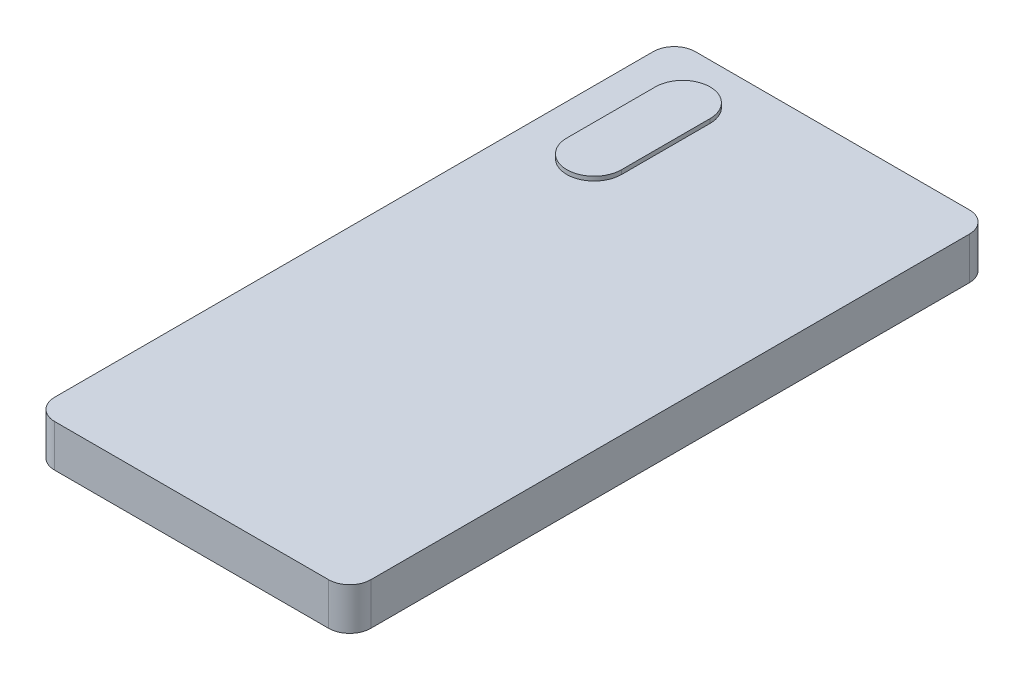
ISO-10303-21;
HEADER;
FILE_DESCRIPTION(('STEP AP214'),'2;1');
FILE_NAME('part.step','',(''),(''),'','','');
FILE_SCHEMA(('AUTOMOTIVE_DESIGN { 1 0 10303 214 1 1 1 1 }'));
ENDSEC;
DATA;
#1=APPLICATION_CONTEXT('core data for automotive mechanical design processes');
#2=APPLICATION_PROTOCOL_DEFINITION('international standard','automotive_design',2000,#1);
#3=PRODUCT_CONTEXT('',#1,'mechanical');
#4=PRODUCT('Part','Part','',(#3));
#5=PRODUCT_RELATED_PRODUCT_CATEGORY('part','',(#4));
#6=PRODUCT_DEFINITION_FORMATION('','',#4);
#7=PRODUCT_DEFINITION_CONTEXT('part definition',#1,'design');
#8=PRODUCT_DEFINITION('design','',#6,#7);
#9=PRODUCT_DEFINITION_SHAPE('','',#8);
#10=(LENGTH_UNIT() NAMED_UNIT(*) SI_UNIT(.MILLI.,.METRE.));
#11=(NAMED_UNIT(*) PLANE_ANGLE_UNIT() SI_UNIT($,.RADIAN.));
#12=(NAMED_UNIT(*) SI_UNIT($,.STERADIAN.) SOLID_ANGLE_UNIT());
#13=UNCERTAINTY_MEASURE_WITH_UNIT(LENGTH_MEASURE(1.E-05),#10,'distance_accuracy_value','');
#14=(GEOMETRIC_REPRESENTATION_CONTEXT(3) GLOBAL_UNCERTAINTY_ASSIGNED_CONTEXT((#13)) GLOBAL_UNIT_ASSIGNED_CONTEXT((#10,
#11,#12)) REPRESENTATION_CONTEXT('',''));
#15=CARTESIAN_POINT('',(0.,0.,0.));
#16=DIRECTION('',(0.,0.,1.));
#17=DIRECTION('',(1.,0.,0.));
#18=AXIS2_PLACEMENT_3D('',#15,#16,#17);
#19=CARTESIAN_POINT('',(-32.5,10.,71.));
#20=DIRECTION('',(0.,1.,0.));
#21=DIRECTION('',(0.,0.,1.));
#22=AXIS2_PLACEMENT_3D('',#19,#20,#21);
#23=PLANE('',#22);
#24=CARTESIAN_POINT('',(-32.5,10.,71.));
#25=DIRECTION('',(0.,1.,0.));
#26=DIRECTION('',(0.,0.,1.));
#27=AXIS2_PLACEMENT_3D('',#24,#25,#26);
#28=CIRCLE('',#27,5.);
#29=CARTESIAN_POINT('',(-37.5,10.,71.));
#30=VERTEX_POINT('',#29);
#31=CARTESIAN_POINT('',(-32.5,10.,76.));
#32=VERTEX_POINT('',#31);
#33=EDGE_CURVE('E166',#30,#32,#28,.T.);
#34=ORIENTED_EDGE('',*,*,#33,.T.);
#35=DIRECTION('',(1.,0.,0.));
#36=VECTOR('',#35,1.);
#37=CARTESIAN_POINT('',(-32.5,10.,76.));
#38=LINE('',#37,#36);
#39=CARTESIAN_POINT('',(32.5,10.,76.));
#40=VERTEX_POINT('',#39);
#41=EDGE_CURVE('E106',#32,#40,#38,.T.);
#42=ORIENTED_EDGE('',*,*,#41,.T.);
#43=CARTESIAN_POINT('',(32.5,10.,71.));
#44=DIRECTION('',(0.,1.,0.));
#45=DIRECTION('',(0.,0.,-1.));
#46=AXIS2_PLACEMENT_3D('',#43,#44,#45);
#47=CIRCLE('',#46,5.);
#48=CARTESIAN_POINT('',(37.5,10.,71.));
#49=VERTEX_POINT('',#48);
#50=EDGE_CURVE('E181',#40,#49,#47,.T.);
#51=ORIENTED_EDGE('',*,*,#50,.T.);
#52=DIRECTION('',(0.,0.,-1.));
#53=VECTOR('',#52,1.);
#54=CARTESIAN_POINT('',(37.5,10.,-71.));
#55=LINE('',#54,#53);
#56=CARTESIAN_POINT('',(37.5,10.,-71.));
#57=VERTEX_POINT('',#56);
#58=EDGE_CURVE('E193',#49,#57,#55,.T.);
#59=ORIENTED_EDGE('',*,*,#58,.T.);
#60=CARTESIAN_POINT('',(32.5,10.,-71.));
#61=DIRECTION('',(0.,1.,0.));
#62=DIRECTION('',(0.,0.,1.));
#63=AXIS2_PLACEMENT_3D('',#60,#61,#62);
#64=CIRCLE('',#63,5.);
#65=CARTESIAN_POINT('',(32.4999999999999,10.,-76.));
#66=VERTEX_POINT('',#65);
#67=EDGE_CURVE('E129',#57,#66,#64,.T.);
#68=ORIENTED_EDGE('',*,*,#67,.T.);
#69=DIRECTION('',(-1.,0.,0.));
#70=VECTOR('',#69,1.);
#71=CARTESIAN_POINT('',(-32.5,10.,-76.));
#72=LINE('',#71,#70);
#73=CARTESIAN_POINT('',(-32.5,10.,-76.));
#74=VERTEX_POINT('',#73);
#75=EDGE_CURVE('E122',#66,#74,#72,.T.);
#76=ORIENTED_EDGE('',*,*,#75,.T.);
#77=CARTESIAN_POINT('',(-32.5,10.,-71.));
#78=DIRECTION('',(0.,1.,0.));
#79=DIRECTION('',(0.,0.,-1.));
#80=AXIS2_PLACEMENT_3D('',#77,#78,#79);
#81=CIRCLE('',#80,5.);
#82=CARTESIAN_POINT('',(-37.5,10.,-71.));
#83=VERTEX_POINT('',#82);
#84=EDGE_CURVE('E126',#74,#83,#81,.T.);
#85=ORIENTED_EDGE('',*,*,#84,.T.);
#86=DIRECTION('',(0.,0.,1.));
#87=VECTOR('',#86,1.);
#88=CARTESIAN_POINT('',(-37.5,10.,-71.));
#89=LINE('',#88,#87);
#90=EDGE_CURVE('E65',#83,#30,#89,.T.);
#91=ORIENTED_EDGE('',*,*,#90,.T.);
#92=EDGE_LOOP('',(#34,#42,#51,#59,#68,#76,#85,#91));
#93=FACE_BOUND('',#92,.T.);
#94=DIRECTION('',(0.,0.,1.));
#95=VECTOR('',#94,1.);
#96=CARTESIAN_POINT('',(-29.,10.,-63.));
#97=LINE('',#96,#95);
#98=CARTESIAN_POINT('',(-29.,10.,-63.));
#99=VERTEX_POINT('',#98);
#100=CARTESIAN_POINT('',(-29.,10.,-42.));
#101=VERTEX_POINT('',#100);
#102=EDGE_CURVE('E214',#99,#101,#97,.T.);
#103=ORIENTED_EDGE('',*,*,#102,.F.);
#104=CARTESIAN_POINT('',(-22.5,10.,-63.));
#105=DIRECTION('',(0.,1.,0.));
#106=DIRECTION('',(0.,0.,-1.));
#107=AXIS2_PLACEMENT_3D('',#104,#105,#106);
#108=CIRCLE('',#107,6.5);
#109=CARTESIAN_POINT('',(-16.,10.,-63.));
#110=VERTEX_POINT('',#109);
#111=EDGE_CURVE('E217',#110,#99,#108,.T.);
#112=ORIENTED_EDGE('',*,*,#111,.F.);
#113=DIRECTION('',(0.,0.,-1.));
#114=VECTOR('',#113,1.);
#115=CARTESIAN_POINT('',(-16.,10.,-63.));
#116=LINE('',#115,#114);
#117=CARTESIAN_POINT('',(-16.,10.,-42.));
#118=VERTEX_POINT('',#117);
#119=EDGE_CURVE('E209',#118,#110,#116,.T.);
#120=ORIENTED_EDGE('',*,*,#119,.F.);
#121=CARTESIAN_POINT('',(-22.5,10.,-42.));
#122=DIRECTION('',(0.,1.,0.));
#123=DIRECTION('',(0.,0.,1.));
#124=AXIS2_PLACEMENT_3D('',#121,#122,#123);
#125=CIRCLE('',#124,6.5);
#126=EDGE_CURVE('E212',#101,#118,#125,.T.);
#127=ORIENTED_EDGE('',*,*,#126,.F.);
#128=EDGE_LOOP('',(#103,#112,#120,#127));
#129=FACE_BOUND('',#128,.T.);
#130=ADVANCED_FACE('F41',(#93,#129),#23,.T.);
#131=CARTESIAN_POINT('',(-32.5,10.,71.));
#132=DIRECTION('',(0.,-1.,0.));
#133=DIRECTION('',(0.,0.,-1.));
#134=AXIS2_PLACEMENT_3D('',#131,#132,#133);
#135=CYLINDRICAL_SURFACE('',#134,5.);
#136=CARTESIAN_POINT('',(-32.5,0.,71.));
#137=DIRECTION('',(0.,1.,0.));
#138=DIRECTION('',(0.,0.,1.));
#139=AXIS2_PLACEMENT_3D('',#136,#137,#138);
#140=CIRCLE('',#139,5.);
#141=CARTESIAN_POINT('',(-37.5,0.,71.));
#142=VERTEX_POINT('',#141);
#143=CARTESIAN_POINT('',(-32.5,0.,76.));
#144=VERTEX_POINT('',#143);
#145=EDGE_CURVE('E150',#142,#144,#140,.T.);
#146=ORIENTED_EDGE('',*,*,#145,.T.);
#147=DIRECTION('',(0.,-1.,0.));
#148=VECTOR('',#147,1.);
#149=CARTESIAN_POINT('',(-32.5,10.,76.));
#150=LINE('',#149,#148);
#151=EDGE_CURVE('E11',#32,#144,#150,.T.);
#152=ORIENTED_EDGE('',*,*,#151,.F.);
#153=ORIENTED_EDGE('',*,*,#33,.F.);
#154=DIRECTION('',(0.,-1.,0.));
#155=VECTOR('',#154,1.);
#156=CARTESIAN_POINT('',(-37.5,10.,71.));
#157=LINE('',#156,#155);
#158=EDGE_CURVE('E146',#30,#142,#157,.T.);
#159=ORIENTED_EDGE('',*,*,#158,.T.);
#160=EDGE_LOOP('',(#146,#152,#153,#159));
#161=FACE_BOUND('',#160,.T.);
#162=ADVANCED_FACE('F43',(#161),#135,.T.);
#163=CARTESIAN_POINT('',(-32.5,10.,76.));
#164=DIRECTION('',(0.,0.,-1.));
#165=DIRECTION('',(-1.,0.,0.));
#166=AXIS2_PLACEMENT_3D('',#163,#164,#165);
#167=PLANE('',#166);
#168=DIRECTION('',(1.,0.,0.));
#169=VECTOR('',#168,1.);
#170=CARTESIAN_POINT('',(-32.5,0.,76.));
#171=LINE('',#170,#169);
#172=CARTESIAN_POINT('',(32.5,0.,76.));
#173=VERTEX_POINT('',#172);
#174=EDGE_CURVE('E153',#144,#173,#171,.T.);
#175=ORIENTED_EDGE('',*,*,#174,.T.);
#176=DIRECTION('',(0.,-1.,0.));
#177=VECTOR('',#176,1.);
#178=CARTESIAN_POINT('',(32.5,10.,76.));
#179=LINE('',#178,#177);
#180=EDGE_CURVE('E49',#40,#173,#179,.T.);
#181=ORIENTED_EDGE('',*,*,#180,.F.);
#182=ORIENTED_EDGE('',*,*,#41,.F.);
#183=ORIENTED_EDGE('',*,*,#151,.T.);
#184=EDGE_LOOP('',(#175,#181,#182,#183));
#185=FACE_BOUND('',#184,.T.);
#186=ADVANCED_FACE('F265',(#185),#167,.F.);
#187=CARTESIAN_POINT('',(32.5,10.,71.));
#188=DIRECTION('',(0.,-1.,0.));
#189=DIRECTION('',(0.,0.,-1.));
#190=AXIS2_PLACEMENT_3D('',#187,#188,#189);
#191=CYLINDRICAL_SURFACE('',#190,5.);
#192=CARTESIAN_POINT('',(32.5,0.,71.));
#193=DIRECTION('',(0.,1.,0.));
#194=DIRECTION('',(0.,0.,-1.));
#195=AXIS2_PLACEMENT_3D('',#192,#193,#194);
#196=CIRCLE('',#195,5.);
#197=CARTESIAN_POINT('',(37.5,0.,71.));
#198=VERTEX_POINT('',#197);
#199=EDGE_CURVE('E156',#173,#198,#196,.T.);
#200=ORIENTED_EDGE('',*,*,#199,.T.);
#201=DIRECTION('',(0.,-1.,0.));
#202=VECTOR('',#201,1.);
#203=CARTESIAN_POINT('',(37.5,10.,71.));
#204=LINE('',#203,#202);
#205=EDGE_CURVE('E173',#49,#198,#204,.T.);
#206=ORIENTED_EDGE('',*,*,#205,.F.);
#207=ORIENTED_EDGE('',*,*,#50,.F.);
#208=ORIENTED_EDGE('',*,*,#180,.T.);
#209=EDGE_LOOP('',(#200,#206,#207,#208));
#210=FACE_BOUND('',#209,.T.);
#211=ADVANCED_FACE('F179',(#210),#191,.T.);
#212=CARTESIAN_POINT('',(37.5,10.,-71.));
#213=DIRECTION('',(-1.,0.,0.));
#214=DIRECTION('',(0.,0.,1.));
#215=AXIS2_PLACEMENT_3D('',#212,#213,#214);
#216=PLANE('',#215);
#217=DIRECTION('',(0.,0.,-1.));
#218=VECTOR('',#217,1.);
#219=CARTESIAN_POINT('',(37.5,0.,-71.));
#220=LINE('',#219,#218);
#221=CARTESIAN_POINT('',(37.5,0.,-71.));
#222=VERTEX_POINT('',#221);
#223=EDGE_CURVE('E158',#198,#222,#220,.T.);
#224=ORIENTED_EDGE('',*,*,#223,.T.);
#225=DIRECTION('',(0.,-1.,0.));
#226=VECTOR('',#225,1.);
#227=CARTESIAN_POINT('',(37.5,10.,-71.));
#228=LINE('',#227,#226);
#229=EDGE_CURVE('E170',#57,#222,#228,.T.);
#230=ORIENTED_EDGE('',*,*,#229,.F.);
#231=ORIENTED_EDGE('',*,*,#58,.F.);
#232=ORIENTED_EDGE('',*,*,#205,.T.);
#233=EDGE_LOOP('',(#224,#230,#231,#232));
#234=FACE_BOUND('',#233,.T.);
#235=ADVANCED_FACE('F189',(#234),#216,.F.);
#236=CARTESIAN_POINT('',(32.5,10.,-71.));
#237=DIRECTION('',(0.,-1.,0.));
#238=DIRECTION('',(0.,0.,-1.));
#239=AXIS2_PLACEMENT_3D('',#236,#237,#238);
#240=CYLINDRICAL_SURFACE('',#239,5.);
#241=CARTESIAN_POINT('',(32.5,0.,-71.));
#242=DIRECTION('',(0.,1.,0.));
#243=DIRECTION('',(0.,0.,1.));
#244=AXIS2_PLACEMENT_3D('',#241,#242,#243);
#245=CIRCLE('',#244,5.);
#246=CARTESIAN_POINT('',(32.4999999999999,0.,-76.));
#247=VERTEX_POINT('',#246);
#248=EDGE_CURVE('E160',#222,#247,#245,.T.);
#249=ORIENTED_EDGE('',*,*,#248,.T.);
#250=DIRECTION('',(0.,-1.,0.));
#251=VECTOR('',#250,1.);
#252=CARTESIAN_POINT('',(32.4999999999999,10.,-76.));
#253=LINE('',#252,#251);
#254=EDGE_CURVE('E141',#66,#247,#253,.T.);
#255=ORIENTED_EDGE('',*,*,#254,.F.);
#256=ORIENTED_EDGE('',*,*,#67,.F.);
#257=ORIENTED_EDGE('',*,*,#229,.T.);
#258=EDGE_LOOP('',(#249,#255,#256,#257));
#259=FACE_BOUND('',#258,.T.);
#260=ADVANCED_FACE('F192',(#259),#240,.T.);
#261=CARTESIAN_POINT('',(-32.5,10.,-76.));
#262=DIRECTION('',(0.,0.,1.));
#263=DIRECTION('',(1.,0.,0.));
#264=AXIS2_PLACEMENT_3D('',#261,#262,#263);
#265=PLANE('',#264);
#266=DIRECTION('',(-1.,0.,0.));
#267=VECTOR('',#266,1.);
#268=CARTESIAN_POINT('',(-32.5,0.,-76.));
#269=LINE('',#268,#267);
#270=CARTESIAN_POINT('',(-32.5,0.,-76.));
#271=VERTEX_POINT('',#270);
#272=EDGE_CURVE('E138',#247,#271,#269,.T.);
#273=ORIENTED_EDGE('',*,*,#272,.T.);
#274=DIRECTION('',(0.,-1.,0.));
#275=VECTOR('',#274,1.);
#276=CARTESIAN_POINT('',(-32.5,10.,-76.));
#277=LINE('',#276,#275);
#278=EDGE_CURVE('E135',#74,#271,#277,.T.);
#279=ORIENTED_EDGE('',*,*,#278,.F.);
#280=ORIENTED_EDGE('',*,*,#75,.F.);
#281=ORIENTED_EDGE('',*,*,#254,.T.);
#282=EDGE_LOOP('',(#273,#279,#280,#281));
#283=FACE_BOUND('',#282,.T.);
#284=ADVANCED_FACE('F136',(#283),#265,.F.);
#285=CARTESIAN_POINT('',(-32.5,10.,-71.));
#286=DIRECTION('',(0.,-1.,0.));
#287=DIRECTION('',(0.,0.,-1.));
#288=AXIS2_PLACEMENT_3D('',#285,#286,#287);
#289=CYLINDRICAL_SURFACE('',#288,5.);
#290=CARTESIAN_POINT('',(-32.5,0.,-71.));
#291=DIRECTION('',(0.,1.,0.));
#292=DIRECTION('',(0.,0.,-1.));
#293=AXIS2_PLACEMENT_3D('',#290,#291,#292);
#294=CIRCLE('',#293,5.);
#295=CARTESIAN_POINT('',(-37.5,0.,-71.));
#296=VERTEX_POINT('',#295);
#297=EDGE_CURVE('E163',#271,#296,#294,.T.);
#298=ORIENTED_EDGE('',*,*,#297,.T.);
#299=DIRECTION('',(0.,-1.,0.));
#300=VECTOR('',#299,1.);
#301=CARTESIAN_POINT('',(-37.5,10.,-71.));
#302=LINE('',#301,#300);
#303=EDGE_CURVE('E142',#83,#296,#302,.T.);
#304=ORIENTED_EDGE('',*,*,#303,.F.);
#305=ORIENTED_EDGE('',*,*,#84,.F.);
#306=ORIENTED_EDGE('',*,*,#278,.T.);
#307=EDGE_LOOP('',(#298,#304,#305,#306));
#308=FACE_BOUND('',#307,.T.);
#309=ADVANCED_FACE('F144',(#308),#289,.T.);
#310=CARTESIAN_POINT('',(-37.5,10.,-71.));
#311=DIRECTION('',(1.,0.,0.));
#312=DIRECTION('',(0.,0.,-1.));
#313=AXIS2_PLACEMENT_3D('',#310,#311,#312);
#314=PLANE('',#313);
#315=DIRECTION('',(0.,0.,1.));
#316=VECTOR('',#315,1.);
#317=CARTESIAN_POINT('',(-37.5,0.,-71.));
#318=LINE('',#317,#316);
#319=EDGE_CURVE('E98',#296,#142,#318,.T.);
#320=ORIENTED_EDGE('',*,*,#319,.T.);
#321=ORIENTED_EDGE('',*,*,#158,.F.);
#322=ORIENTED_EDGE('',*,*,#90,.F.);
#323=ORIENTED_EDGE('',*,*,#303,.T.);
#324=EDGE_LOOP('',(#320,#321,#322,#323));
#325=FACE_BOUND('',#324,.T.);
#326=ADVANCED_FACE('F271',(#325),#314,.F.);
#327=CARTESIAN_POINT('',(-32.5,0.,71.));
#328=DIRECTION('',(0.,1.,0.));
#329=DIRECTION('',(0.,0.,1.));
#330=AXIS2_PLACEMENT_3D('',#327,#328,#329);
#331=PLANE('',#330);
#332=ORIENTED_EDGE('',*,*,#145,.F.);
#333=ORIENTED_EDGE('',*,*,#319,.F.);
#334=ORIENTED_EDGE('',*,*,#297,.F.);
#335=ORIENTED_EDGE('',*,*,#272,.F.);
#336=ORIENTED_EDGE('',*,*,#248,.F.);
#337=ORIENTED_EDGE('',*,*,#223,.F.);
#338=ORIENTED_EDGE('',*,*,#199,.F.);
#339=ORIENTED_EDGE('',*,*,#174,.F.);
#340=EDGE_LOOP('',(#332,#333,#334,#335,#336,#337,#338,#339));
#341=FACE_BOUND('',#340,.T.);
#342=ADVANCED_FACE('F185',(#341),#331,.F.);
#343=CARTESIAN_POINT('',(-22.5,11.,-63.));
#344=DIRECTION('',(0.,-1.,0.));
#345=DIRECTION('',(0.,0.,-1.));
#346=AXIS2_PLACEMENT_3D('',#343,#344,#345);
#347=CYLINDRICAL_SURFACE('',#346,6.5);
#348=ORIENTED_EDGE('',*,*,#111,.T.);
#349=DIRECTION('',(0.,-1.,0.));
#350=VECTOR('',#349,1.);
#351=CARTESIAN_POINT('',(-29.,11.,-63.));
#352=LINE('',#351,#350);
#353=CARTESIAN_POINT('',(-29.,11.,-63.));
#354=VERTEX_POINT('',#353);
#355=EDGE_CURVE('E154',#354,#99,#352,.T.);
#356=ORIENTED_EDGE('',*,*,#355,.F.);
#357=CARTESIAN_POINT('',(-22.5,11.,-63.));
#358=DIRECTION('',(0.,1.,0.));
#359=DIRECTION('',(0.,0.,-1.));
#360=AXIS2_PLACEMENT_3D('',#357,#358,#359);
#361=CIRCLE('',#360,6.5);
#362=CARTESIAN_POINT('',(-16.,11.,-63.));
#363=VERTEX_POINT('',#362);
#364=EDGE_CURVE('E211',#363,#354,#361,.T.);
#365=ORIENTED_EDGE('',*,*,#364,.F.);
#366=DIRECTION('',(0.,-1.,0.));
#367=VECTOR('',#366,1.);
#368=CARTESIAN_POINT('',(-16.,11.,-63.));
#369=LINE('',#368,#367);
#370=EDGE_CURVE('E205',#363,#110,#369,.T.);
#371=ORIENTED_EDGE('',*,*,#370,.T.);
#372=EDGE_LOOP('',(#348,#356,#365,#371));
#373=FACE_BOUND('',#372,.T.);
#374=ADVANCED_FACE('F240',(#373),#347,.T.);
#375=CARTESIAN_POINT('',(-29.,11.,-63.));
#376=DIRECTION('',(1.,0.,0.));
#377=DIRECTION('',(0.,0.,-1.));
#378=AXIS2_PLACEMENT_3D('',#375,#376,#377);
#379=PLANE('',#378);
#380=ORIENTED_EDGE('',*,*,#102,.T.);
#381=DIRECTION('',(0.,-1.,0.));
#382=VECTOR('',#381,1.);
#383=CARTESIAN_POINT('',(-29.,11.,-42.));
#384=LINE('',#383,#382);
#385=CARTESIAN_POINT('',(-29.,11.,-42.));
#386=VERTEX_POINT('',#385);
#387=EDGE_CURVE('E201',#386,#101,#384,.T.);
#388=ORIENTED_EDGE('',*,*,#387,.F.);
#389=DIRECTION('',(0.,0.,1.));
#390=VECTOR('',#389,1.);
#391=CARTESIAN_POINT('',(-29.,11.,-63.));
#392=LINE('',#391,#390);
#393=EDGE_CURVE('E225',#354,#386,#392,.T.);
#394=ORIENTED_EDGE('',*,*,#393,.F.);
#395=ORIENTED_EDGE('',*,*,#355,.T.);
#396=EDGE_LOOP('',(#380,#388,#394,#395));
#397=FACE_BOUND('',#396,.T.);
#398=ADVANCED_FACE('F245',(#397),#379,.F.);
#399=CARTESIAN_POINT('',(-22.5,11.,-42.));
#400=DIRECTION('',(0.,-1.,0.));
#401=DIRECTION('',(0.,0.,-1.));
#402=AXIS2_PLACEMENT_3D('',#399,#400,#401);
#403=CYLINDRICAL_SURFACE('',#402,6.5);
#404=ORIENTED_EDGE('',*,*,#126,.T.);
#405=DIRECTION('',(0.,-1.,0.));
#406=VECTOR('',#405,1.);
#407=CARTESIAN_POINT('',(-16.,11.,-42.));
#408=LINE('',#407,#406);
#409=CARTESIAN_POINT('',(-16.,11.,-42.));
#410=VERTEX_POINT('',#409);
#411=EDGE_CURVE('E56',#410,#118,#408,.T.);
#412=ORIENTED_EDGE('',*,*,#411,.F.);
#413=CARTESIAN_POINT('',(-22.5,11.,-42.));
#414=DIRECTION('',(0.,1.,0.));
#415=DIRECTION('',(0.,0.,1.));
#416=AXIS2_PLACEMENT_3D('',#413,#414,#415);
#417=CIRCLE('',#416,6.5);
#418=EDGE_CURVE('E222',#386,#410,#417,.T.);
#419=ORIENTED_EDGE('',*,*,#418,.F.);
#420=ORIENTED_EDGE('',*,*,#387,.T.);
#421=EDGE_LOOP('',(#404,#412,#419,#420));
#422=FACE_BOUND('',#421,.T.);
#423=ADVANCED_FACE('F254',(#422),#403,.T.);
#424=CARTESIAN_POINT('',(-16.,11.,-63.));
#425=DIRECTION('',(-1.,0.,0.));
#426=DIRECTION('',(0.,0.,1.));
#427=AXIS2_PLACEMENT_3D('',#424,#425,#426);
#428=PLANE('',#427);
#429=ORIENTED_EDGE('',*,*,#119,.T.);
#430=ORIENTED_EDGE('',*,*,#370,.F.);
#431=DIRECTION('',(0.,0.,-1.));
#432=VECTOR('',#431,1.);
#433=CARTESIAN_POINT('',(-16.,11.,-63.));
#434=LINE('',#433,#432);
#435=EDGE_CURVE('E208',#410,#363,#434,.T.);
#436=ORIENTED_EDGE('',*,*,#435,.F.);
#437=ORIENTED_EDGE('',*,*,#411,.T.);
#438=EDGE_LOOP('',(#429,#430,#436,#437));
#439=FACE_BOUND('',#438,.T.);
#440=ADVANCED_FACE('F257',(#439),#428,.F.);
#441=CARTESIAN_POINT('',(-22.5,11.,-63.));
#442=DIRECTION('',(0.,-1.,0.));
#443=DIRECTION('',(0.,0.,-1.));
#444=AXIS2_PLACEMENT_3D('',#441,#442,#443);
#445=PLANE('',#444);
#446=ORIENTED_EDGE('',*,*,#364,.T.);
#447=ORIENTED_EDGE('',*,*,#393,.T.);
#448=ORIENTED_EDGE('',*,*,#418,.T.);
#449=ORIENTED_EDGE('',*,*,#435,.T.);
#450=EDGE_LOOP('',(#446,#447,#448,#449));
#451=FACE_BOUND('',#450,.T.);
#452=ADVANCED_FACE('F233',(#451),#445,.F.);
#453=CLOSED_SHELL('',(#130,#162,#186,#211,#235,#260,#284,#309,#326,#342,#374,#398,#423,#440,#452));
#454=MANIFOLD_SOLID_BREP('B2',#453);
#455=ADVANCED_BREP_SHAPE_REPRESENTATION('',(#18,#454),#14);
#456=SHAPE_DEFINITION_REPRESENTATION(#9,#455);
ENDSEC;
END-ISO-10303-21;
